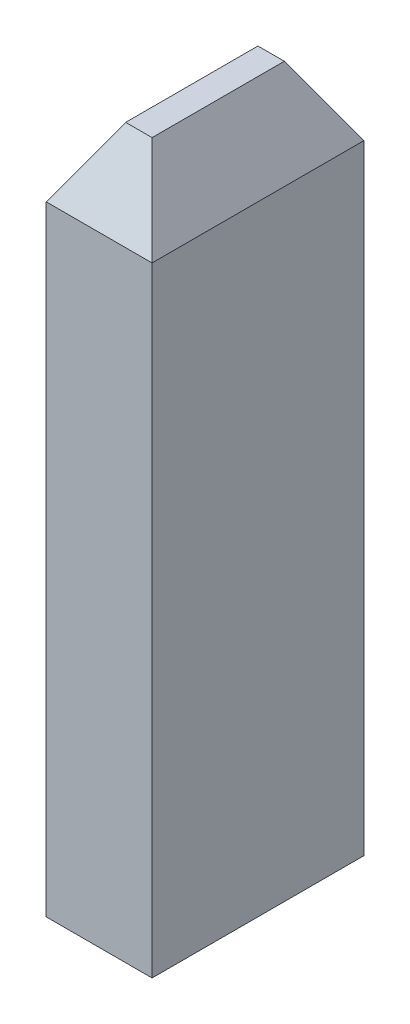
ISO-10303-21;
HEADER;
FILE_DESCRIPTION(('STEP AP214'),'2;1');
FILE_NAME('part.step','',(''),(''),'','','');
FILE_SCHEMA(('AUTOMOTIVE_DESIGN { 1 0 10303 214 1 1 1 1 }'));
ENDSEC;
DATA;
#1=APPLICATION_CONTEXT('core data for automotive mechanical design processes');
#2=APPLICATION_PROTOCOL_DEFINITION('international standard','automotive_design',2000,#1);
#3=PRODUCT_CONTEXT('',#1,'mechanical');
#4=PRODUCT('Part','Part','',(#3));
#5=PRODUCT_RELATED_PRODUCT_CATEGORY('part','',(#4));
#6=PRODUCT_DEFINITION_FORMATION('','',#4);
#7=PRODUCT_DEFINITION_CONTEXT('part definition',#1,'design');
#8=PRODUCT_DEFINITION('design','',#6,#7);
#9=PRODUCT_DEFINITION_SHAPE('','',#8);
#10=(LENGTH_UNIT() NAMED_UNIT(*) SI_UNIT(.MILLI.,.METRE.));
#11=(NAMED_UNIT(*) PLANE_ANGLE_UNIT() SI_UNIT($,.RADIAN.));
#12=(NAMED_UNIT(*) SI_UNIT($,.STERADIAN.) SOLID_ANGLE_UNIT());
#13=UNCERTAINTY_MEASURE_WITH_UNIT(LENGTH_MEASURE(1.E-05),#10,'distance_accuracy_value','');
#14=(GEOMETRIC_REPRESENTATION_CONTEXT(3) GLOBAL_UNCERTAINTY_ASSIGNED_CONTEXT((#13)) GLOBAL_UNIT_ASSIGNED_CONTEXT((#10,
#11,#12)) REPRESENTATION_CONTEXT('',''));
#15=CARTESIAN_POINT('',(0.,0.,0.));
#16=DIRECTION('',(0.,0.,1.));
#17=DIRECTION('',(1.,0.,0.));
#18=AXIS2_PLACEMENT_3D('',#15,#16,#17);
#19=CARTESIAN_POINT('',(-0.249444650053483,13.,0.));
#20=DIRECTION('',(-0.86602540378444,0.499999999999998,0.));
#21=DIRECTION('',(-0.499999999999998,-0.86602540378444,0.));
#22=AXIS2_PLACEMENT_3D('',#19,#20,#21);
#23=PLANE('',#22);
#24=DIRECTION('',(0.,0.,1.));
#25=VECTOR('',#24,1.);
#26=CARTESIAN_POINT('',(-0.249444650053483,13.,0.));
#27=LINE('',#26,#25);
#28=CARTESIAN_POINT('',(-0.249444650053483,13.,-1.24944465005348));
#29=VERTEX_POINT('',#28);
#30=CARTESIAN_POINT('',(-0.249444650053483,13.,1.24944465005349));
#31=VERTEX_POINT('',#30);
#32=EDGE_CURVE('E72',#29,#31,#27,.T.);
#33=ORIENTED_EDGE('',*,*,#32,.F.);
#34=DIRECTION('',(0.447213595499956,0.774596669241485,0.447213595499956));
#35=VECTOR('',#34,1.);
#36=CARTESIAN_POINT('',(-1.,11.7,-2.));
#37=LINE('',#36,#35);
#38=CARTESIAN_POINT('',(-1.,11.7,-2.));
#39=VERTEX_POINT('',#38);
#40=EDGE_CURVE('E66',#39,#29,#37,.T.);
#41=ORIENTED_EDGE('',*,*,#40,.F.);
#42=DIRECTION('',(0.,0.,-1.));
#43=VECTOR('',#42,1.);
#44=CARTESIAN_POINT('',(-1.,11.7,-2.));
#45=LINE('',#44,#43);
#46=CARTESIAN_POINT('',(-1.,11.7,2.));
#47=VERTEX_POINT('',#46);
#48=EDGE_CURVE('E84',#39,#47,#45,.F.);
#49=ORIENTED_EDGE('',*,*,#48,.T.);
#50=DIRECTION('',(-0.447213595499956,-0.774596669241485,0.447213595499956));
#51=VECTOR('',#50,1.);
#52=CARTESIAN_POINT('',(-0.249444650053483,13.,1.24944465005349));
#53=LINE('',#52,#51);
#54=EDGE_CURVE('E20',#31,#47,#53,.T.);
#55=ORIENTED_EDGE('',*,*,#54,.F.);
#56=EDGE_LOOP('',(#33,#41,#49,#55));
#57=FACE_BOUND('',#56,.T.);
#58=ADVANCED_FACE('F17',(#57),#23,.T.);
#59=CARTESIAN_POINT('',(0.,13.,1.24944465005349));
#60=DIRECTION('',(0.,0.499999999999998,0.86602540378444));
#61=DIRECTION('',(0.,-0.86602540378444,0.499999999999998));
#62=AXIS2_PLACEMENT_3D('',#59,#60,#61);
#63=PLANE('',#62);
#64=DIRECTION('',(-0.447213595499957,0.774596669241485,-0.447213595499956));
#65=VECTOR('',#64,1.);
#66=CARTESIAN_POINT('',(1.,11.7,2.));
#67=LINE('',#66,#65);
#68=CARTESIAN_POINT('',(1.,11.7,2.));
#69=VERTEX_POINT('',#68);
#70=CARTESIAN_POINT('',(0.249444650053483,13.,1.24944465005349));
#71=VERTEX_POINT('',#70);
#72=EDGE_CURVE('E81',#69,#71,#67,.T.);
#73=ORIENTED_EDGE('',*,*,#72,.T.);
#74=DIRECTION('',(1.,0.,0.));
#75=VECTOR('',#74,1.);
#76=CARTESIAN_POINT('',(0.,13.,1.24944465005349));
#77=LINE('',#76,#75);
#78=EDGE_CURVE('E77',#31,#71,#77,.T.);
#79=ORIENTED_EDGE('',*,*,#78,.F.);
#80=ORIENTED_EDGE('',*,*,#54,.T.);
#81=DIRECTION('',(-1.,0.,0.));
#82=VECTOR('',#81,1.);
#83=CARTESIAN_POINT('',(-1.,11.7,2.));
#84=LINE('',#83,#82);
#85=EDGE_CURVE('E102',#47,#69,#84,.F.);
#86=ORIENTED_EDGE('',*,*,#85,.T.);
#87=EDGE_LOOP('',(#73,#79,#80,#86));
#88=FACE_BOUND('',#87,.T.);
#89=ADVANCED_FACE('F88',(#88),#63,.T.);
#90=CARTESIAN_POINT('',(0.,13.,0.));
#91=DIRECTION('',(0.,1.,0.));
#92=DIRECTION('',(0.,0.,1.));
#93=AXIS2_PLACEMENT_3D('',#90,#91,#92);
#94=PLANE('',#93);
#95=DIRECTION('',(0.,0.,1.));
#96=VECTOR('',#95,1.);
#97=CARTESIAN_POINT('',(0.249444650053483,13.,0.));
#98=LINE('',#97,#96);
#99=CARTESIAN_POINT('',(0.249444650053483,13.,-1.24944465005348));
#100=VERTEX_POINT('',#99);
#101=EDGE_CURVE('E104',#100,#71,#98,.T.);
#102=ORIENTED_EDGE('',*,*,#101,.F.);
#103=DIRECTION('',(1.,0.,0.));
#104=VECTOR('',#103,1.);
#105=CARTESIAN_POINT('',(0.,13.,-1.24944465005348));
#106=LINE('',#105,#104);
#107=EDGE_CURVE('E79',#29,#100,#106,.T.);
#108=ORIENTED_EDGE('',*,*,#107,.F.);
#109=ORIENTED_EDGE('',*,*,#32,.T.);
#110=ORIENTED_EDGE('',*,*,#78,.T.);
#111=EDGE_LOOP('',(#102,#108,#109,#110));
#112=FACE_BOUND('',#111,.T.);
#113=ADVANCED_FACE('F75',(#112),#94,.T.);
#114=CARTESIAN_POINT('',(0.,13.,-1.24944465005348));
#115=DIRECTION('',(0.,0.499999999999998,-0.86602540378444));
#116=DIRECTION('',(0.,0.86602540378444,0.499999999999998));
#117=AXIS2_PLACEMENT_3D('',#114,#115,#116);
#118=PLANE('',#117);
#119=ORIENTED_EDGE('',*,*,#40,.T.);
#120=ORIENTED_EDGE('',*,*,#107,.T.);
#121=DIRECTION('',(-0.447213595499957,0.774596669241485,0.447213595499955));
#122=VECTOR('',#121,1.);
#123=CARTESIAN_POINT('',(1.,11.7,-2.));
#124=LINE('',#123,#122);
#125=CARTESIAN_POINT('',(1.,11.7,-2.));
#126=VERTEX_POINT('',#125);
#127=EDGE_CURVE('E106',#126,#100,#124,.T.);
#128=ORIENTED_EDGE('',*,*,#127,.F.);
#129=DIRECTION('',(1.,0.,0.));
#130=VECTOR('',#129,1.);
#131=CARTESIAN_POINT('',(-1.,11.7,-2.));
#132=LINE('',#131,#130);
#133=EDGE_CURVE('E34',#126,#39,#132,.F.);
#134=ORIENTED_EDGE('',*,*,#133,.T.);
#135=EDGE_LOOP('',(#119,#120,#128,#134));
#136=FACE_BOUND('',#135,.T.);
#137=ADVANCED_FACE('F154',(#136),#118,.T.);
#138=CARTESIAN_POINT('',(-1.,13.,-2.));
#139=DIRECTION('',(1.,0.,0.));
#140=DIRECTION('',(0.,0.,-1.));
#141=AXIS2_PLACEMENT_3D('',#138,#139,#140);
#142=PLANE('',#141);
#143=ORIENTED_EDGE('',*,*,#48,.F.);
#144=DIRECTION('',(0.,1.,0.));
#145=VECTOR('',#144,1.);
#146=CARTESIAN_POINT('',(-1.,13.,-2.));
#147=LINE('',#146,#145);
#148=CARTESIAN_POINT('',(-1.,0.,-2.));
#149=VERTEX_POINT('',#148);
#150=EDGE_CURVE('E113',#39,#149,#147,.F.);
#151=ORIENTED_EDGE('',*,*,#150,.T.);
#152=DIRECTION('',(0.,0.,1.));
#153=VECTOR('',#152,1.);
#154=CARTESIAN_POINT('',(-1.,0.,0.));
#155=LINE('',#154,#153);
#156=CARTESIAN_POINT('',(-1.,0.,2.));
#157=VERTEX_POINT('',#156);
#158=EDGE_CURVE('E94',#149,#157,#155,.T.);
#159=ORIENTED_EDGE('',*,*,#158,.T.);
#160=DIRECTION('',(0.,1.,0.));
#161=VECTOR('',#160,1.);
#162=CARTESIAN_POINT('',(-1.,13.,2.));
#163=LINE('',#162,#161);
#164=EDGE_CURVE('E99',#157,#47,#163,.T.);
#165=ORIENTED_EDGE('',*,*,#164,.T.);
#166=EDGE_LOOP('',(#143,#151,#159,#165));
#167=FACE_BOUND('',#166,.T.);
#168=ADVANCED_FACE('F151',(#167),#142,.F.);
#169=CARTESIAN_POINT('',(0.,0.,0.));
#170=DIRECTION('',(0.,1.,0.));
#171=DIRECTION('',(0.,0.,1.));
#172=AXIS2_PLACEMENT_3D('',#169,#170,#171);
#173=PLANE('',#172);
#174=DIRECTION('',(-1.,0.,0.));
#175=VECTOR('',#174,1.);
#176=CARTESIAN_POINT('',(-1.,0.,2.));
#177=LINE('',#176,#175);
#178=CARTESIAN_POINT('',(1.,0.,2.));
#179=VERTEX_POINT('',#178);
#180=EDGE_CURVE('E96',#179,#157,#177,.T.);
#181=ORIENTED_EDGE('',*,*,#180,.T.);
#182=ORIENTED_EDGE('',*,*,#158,.F.);
#183=DIRECTION('',(1.,0.,0.));
#184=VECTOR('',#183,1.);
#185=CARTESIAN_POINT('',(-1.,0.,-2.));
#186=LINE('',#185,#184);
#187=CARTESIAN_POINT('',(1.,0.,-2.));
#188=VERTEX_POINT('',#187);
#189=EDGE_CURVE('E109',#149,#188,#186,.T.);
#190=ORIENTED_EDGE('',*,*,#189,.T.);
#191=DIRECTION('',(0.,0.,1.));
#192=VECTOR('',#191,1.);
#193=CARTESIAN_POINT('',(1.,0.,-2.));
#194=LINE('',#193,#192);
#195=EDGE_CURVE('E116',#188,#179,#194,.T.);
#196=ORIENTED_EDGE('',*,*,#195,.T.);
#197=EDGE_LOOP('',(#181,#182,#190,#196));
#198=FACE_BOUND('',#197,.T.);
#199=ADVANCED_FACE('F134',(#198),#173,.F.);
#200=CARTESIAN_POINT('',(-1.,13.,2.));
#201=DIRECTION('',(0.,0.,-1.));
#202=DIRECTION('',(-1.,0.,0.));
#203=AXIS2_PLACEMENT_3D('',#200,#201,#202);
#204=PLANE('',#203);
#205=ORIENTED_EDGE('',*,*,#85,.F.);
#206=ORIENTED_EDGE('',*,*,#164,.F.);
#207=ORIENTED_EDGE('',*,*,#180,.F.);
#208=DIRECTION('',(0.,1.,0.));
#209=VECTOR('',#208,1.);
#210=CARTESIAN_POINT('',(1.,13.,2.));
#211=LINE('',#210,#209);
#212=EDGE_CURVE('E119',#179,#69,#211,.T.);
#213=ORIENTED_EDGE('',*,*,#212,.T.);
#214=EDGE_LOOP('',(#205,#206,#207,#213));
#215=FACE_BOUND('',#214,.T.);
#216=ADVANCED_FACE('F131',(#215),#204,.F.);
#217=CARTESIAN_POINT('',(0.249444650053483,13.,0.));
#218=DIRECTION('',(0.86602540378444,0.499999999999998,0.));
#219=DIRECTION('',(-0.499999999999998,0.86602540378444,0.));
#220=AXIS2_PLACEMENT_3D('',#217,#218,#219);
#221=PLANE('',#220);
#222=DIRECTION('',(0.,0.,1.));
#223=VECTOR('',#222,1.);
#224=CARTESIAN_POINT('',(1.,11.7,-2.));
#225=LINE('',#224,#223);
#226=EDGE_CURVE('E26',#69,#126,#225,.F.);
#227=ORIENTED_EDGE('',*,*,#226,.T.);
#228=ORIENTED_EDGE('',*,*,#127,.T.);
#229=ORIENTED_EDGE('',*,*,#101,.T.);
#230=ORIENTED_EDGE('',*,*,#72,.F.);
#231=EDGE_LOOP('',(#227,#228,#229,#230));
#232=FACE_BOUND('',#231,.T.);
#233=ADVANCED_FACE('F125',(#232),#221,.T.);
#234=CARTESIAN_POINT('',(-1.,13.,-2.));
#235=DIRECTION('',(0.,0.,1.));
#236=DIRECTION('',(1.,0.,0.));
#237=AXIS2_PLACEMENT_3D('',#234,#235,#236);
#238=PLANE('',#237);
#239=ORIENTED_EDGE('',*,*,#133,.F.);
#240=DIRECTION('',(0.,1.,0.));
#241=VECTOR('',#240,1.);
#242=CARTESIAN_POINT('',(1.,13.,-2.));
#243=LINE('',#242,#241);
#244=EDGE_CURVE('E11',#126,#188,#243,.F.);
#245=ORIENTED_EDGE('',*,*,#244,.T.);
#246=ORIENTED_EDGE('',*,*,#189,.F.);
#247=ORIENTED_EDGE('',*,*,#150,.F.);
#248=EDGE_LOOP('',(#239,#245,#246,#247));
#249=FACE_BOUND('',#248,.T.);
#250=ADVANCED_FACE('F136',(#249),#238,.F.);
#251=CARTESIAN_POINT('',(1.,13.,-2.));
#252=DIRECTION('',(-1.,0.,0.));
#253=DIRECTION('',(0.,0.,1.));
#254=AXIS2_PLACEMENT_3D('',#251,#252,#253);
#255=PLANE('',#254);
#256=ORIENTED_EDGE('',*,*,#226,.F.);
#257=ORIENTED_EDGE('',*,*,#212,.F.);
#258=ORIENTED_EDGE('',*,*,#195,.F.);
#259=ORIENTED_EDGE('',*,*,#244,.F.);
#260=EDGE_LOOP('',(#256,#257,#258,#259));
#261=FACE_BOUND('',#260,.T.);
#262=ADVANCED_FACE('F129',(#261),#255,.F.);
#263=CLOSED_SHELL('',(#58,#89,#113,#137,#168,#199,#216,#233,#250,#262));
#264=MANIFOLD_SOLID_BREP('B1',#263);
#265=ADVANCED_BREP_SHAPE_REPRESENTATION('',(#18,#264),#14);
#266=SHAPE_DEFINITION_REPRESENTATION(#9,#265);
ENDSEC;
END-ISO-10303-21;
